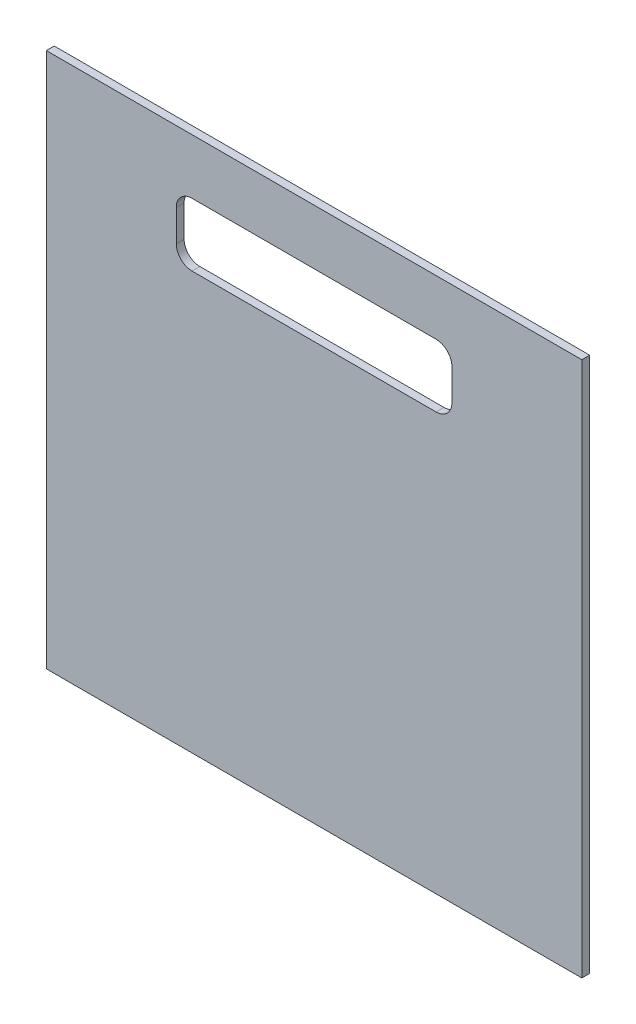
ISO-10303-21;
HEADER;
FILE_DESCRIPTION(('STEP AP214'),'2;1');
FILE_NAME('part.step','',(''),(''),'','','');
FILE_SCHEMA(('AUTOMOTIVE_DESIGN { 1 0 10303 214 1 1 1 1 }'));
ENDSEC;
DATA;
#1=APPLICATION_CONTEXT('core data for automotive mechanical design processes');
#2=APPLICATION_PROTOCOL_DEFINITION('international standard','automotive_design',2000,#1);
#3=PRODUCT_CONTEXT('',#1,'mechanical');
#4=PRODUCT('Part','Part','',(#3));
#5=PRODUCT_RELATED_PRODUCT_CATEGORY('part','',(#4));
#6=PRODUCT_DEFINITION_FORMATION('','',#4);
#7=PRODUCT_DEFINITION_CONTEXT('part definition',#1,'design');
#8=PRODUCT_DEFINITION('design','',#6,#7);
#9=PRODUCT_DEFINITION_SHAPE('','',#8);
#10=(LENGTH_UNIT() NAMED_UNIT(*) SI_UNIT(.MILLI.,.METRE.));
#11=(NAMED_UNIT(*) PLANE_ANGLE_UNIT() SI_UNIT($,.RADIAN.));
#12=(NAMED_UNIT(*) SI_UNIT($,.STERADIAN.) SOLID_ANGLE_UNIT());
#13=UNCERTAINTY_MEASURE_WITH_UNIT(LENGTH_MEASURE(1.E-05),#10,'distance_accuracy_value','');
#14=(GEOMETRIC_REPRESENTATION_CONTEXT(3) GLOBAL_UNCERTAINTY_ASSIGNED_CONTEXT((#13)) GLOBAL_UNIT_ASSIGNED_CONTEXT((#10,
#11,#12)) REPRESENTATION_CONTEXT('',''));
#15=CARTESIAN_POINT('',(0.,0.,0.));
#16=DIRECTION('',(0.,0.,1.));
#17=DIRECTION('',(1.,0.,0.));
#18=AXIS2_PLACEMENT_3D('',#15,#16,#17);
#19=CARTESIAN_POINT('',(0.,0.,1.));
#20=DIRECTION('',(0.,0.,-1.));
#21=DIRECTION('',(-1.,0.,0.));
#22=AXIS2_PLACEMENT_3D('',#19,#20,#21);
#23=PLANE('',#22);
#24=DIRECTION('',(0.,1.,0.));
#25=VECTOR('',#24,1.);
#26=CARTESIAN_POINT('',(34.,-34.,1.));
#27=LINE('',#26,#25);
#28=CARTESIAN_POINT('',(34.,-34.,1.));
#29=VERTEX_POINT('',#28);
#30=CARTESIAN_POINT('',(34.,34.,1.));
#31=VERTEX_POINT('',#30);
#32=EDGE_CURVE('E195',#29,#31,#27,.T.);
#33=ORIENTED_EDGE('',*,*,#32,.T.);
#34=DIRECTION('',(-1.,0.,0.));
#35=VECTOR('',#34,1.);
#36=CARTESIAN_POINT('',(-34.,34.,1.));
#37=LINE('',#36,#35);
#38=CARTESIAN_POINT('',(-34.,34.,1.));
#39=VERTEX_POINT('',#38);
#40=EDGE_CURVE('E198',#31,#39,#37,.T.);
#41=ORIENTED_EDGE('',*,*,#40,.T.);
#42=DIRECTION('',(0.,-1.,0.));
#43=VECTOR('',#42,1.);
#44=CARTESIAN_POINT('',(-34.,-34.,1.));
#45=LINE('',#44,#43);
#46=CARTESIAN_POINT('',(-34.,-34.,1.));
#47=VERTEX_POINT('',#46);
#48=EDGE_CURVE('E201',#39,#47,#45,.T.);
#49=ORIENTED_EDGE('',*,*,#48,.T.);
#50=DIRECTION('',(1.,0.,0.));
#51=VECTOR('',#50,1.);
#52=CARTESIAN_POINT('',(-34.,-34.,1.));
#53=LINE('',#52,#51);
#54=EDGE_CURVE('E203',#47,#29,#53,.T.);
#55=ORIENTED_EDGE('',*,*,#54,.T.);
#56=EDGE_LOOP('',(#33,#41,#49,#55));
#57=FACE_BOUND('',#56,.T.);
#58=CARTESIAN_POINT('',(15.5,21.,1.));
#59=DIRECTION('',(0.,0.,1.));
#60=DIRECTION('',(-1.,0.,0.));
#61=AXIS2_PLACEMENT_3D('',#58,#59,#60);
#62=CIRCLE('',#61,2.);
#63=CARTESIAN_POINT('',(15.5,19.,1.));
#64=VERTEX_POINT('',#63);
#65=CARTESIAN_POINT('',(17.5,21.,1.));
#66=VERTEX_POINT('',#65);
#67=EDGE_CURVE('E130',#64,#66,#62,.T.);
#68=ORIENTED_EDGE('',*,*,#67,.F.);
#69=DIRECTION('',(1.,0.,0.));
#70=VECTOR('',#69,1.);
#71=CARTESIAN_POINT('',(15.5,19.,1.));
#72=LINE('',#71,#70);
#73=CARTESIAN_POINT('',(-15.5,19.,1.));
#74=VERTEX_POINT('',#73);
#75=EDGE_CURVE('E163',#74,#64,#72,.T.);
#76=ORIENTED_EDGE('',*,*,#75,.F.);
#77=CARTESIAN_POINT('',(-15.5,21.,1.));
#78=DIRECTION('',(0.,0.,1.));
#79=DIRECTION('',(1.,0.,0.));
#80=AXIS2_PLACEMENT_3D('',#77,#78,#79);
#81=CIRCLE('',#80,2.);
#82=CARTESIAN_POINT('',(-17.5,21.,1.));
#83=VERTEX_POINT('',#82);
#84=EDGE_CURVE('E161',#83,#74,#81,.T.);
#85=ORIENTED_EDGE('',*,*,#84,.F.);
#86=DIRECTION('',(0.,-1.,0.));
#87=VECTOR('',#86,1.);
#88=CARTESIAN_POINT('',(-17.5,21.,1.));
#89=LINE('',#88,#87);
#90=CARTESIAN_POINT('',(-17.5,25.,1.));
#91=VERTEX_POINT('',#90);
#92=EDGE_CURVE('E159',#91,#83,#89,.T.);
#93=ORIENTED_EDGE('',*,*,#92,.F.);
#94=CARTESIAN_POINT('',(-15.5,25.,1.));
#95=DIRECTION('',(0.,0.,1.));
#96=DIRECTION('',(-1.,0.,0.));
#97=AXIS2_PLACEMENT_3D('',#94,#95,#96);
#98=CIRCLE('',#97,2.);
#99=CARTESIAN_POINT('',(-15.5,27.,1.));
#100=VERTEX_POINT('',#99);
#101=EDGE_CURVE('E157',#100,#91,#98,.T.);
#102=ORIENTED_EDGE('',*,*,#101,.F.);
#103=DIRECTION('',(-1.,0.,0.));
#104=VECTOR('',#103,1.);
#105=CARTESIAN_POINT('',(15.5,27.,1.));
#106=LINE('',#105,#104);
#107=CARTESIAN_POINT('',(15.5,27.,1.));
#108=VERTEX_POINT('',#107);
#109=EDGE_CURVE('E153',#108,#100,#106,.T.);
#110=ORIENTED_EDGE('',*,*,#109,.F.);
#111=CARTESIAN_POINT('',(15.5,25.,1.));
#112=DIRECTION('',(0.,0.,1.));
#113=DIRECTION('',(1.,0.,0.));
#114=AXIS2_PLACEMENT_3D('',#111,#112,#113);
#115=CIRCLE('',#114,2.);
#116=CARTESIAN_POINT('',(17.5,25.,1.));
#117=VERTEX_POINT('',#116);
#118=EDGE_CURVE('E151',#117,#108,#115,.T.);
#119=ORIENTED_EDGE('',*,*,#118,.F.);
#120=DIRECTION('',(0.,1.,0.));
#121=VECTOR('',#120,1.);
#122=CARTESIAN_POINT('',(17.5,21.,1.));
#123=LINE('',#122,#121);
#124=EDGE_CURVE('E138',#66,#117,#123,.T.);
#125=ORIENTED_EDGE('',*,*,#124,.F.);
#126=EDGE_LOOP('',(#68,#76,#85,#93,#102,#110,#119,#125));
#127=FACE_BOUND('',#126,.T.);
#128=ADVANCED_FACE('F41',(#57,#127),#23,.F.);
#129=CARTESIAN_POINT('',(0.,0.,0.));
#130=DIRECTION('',(0.,0.,-1.));
#131=DIRECTION('',(-1.,0.,0.));
#132=AXIS2_PLACEMENT_3D('',#129,#130,#131);
#133=PLANE('',#132);
#134=DIRECTION('',(0.,1.,0.));
#135=VECTOR('',#134,1.);
#136=CARTESIAN_POINT('',(34.,-34.,0.));
#137=LINE('',#136,#135);
#138=CARTESIAN_POINT('',(34.,-34.,0.));
#139=VERTEX_POINT('',#138);
#140=CARTESIAN_POINT('',(34.,34.,0.));
#141=VERTEX_POINT('',#140);
#142=EDGE_CURVE('E146',#139,#141,#137,.T.);
#143=ORIENTED_EDGE('',*,*,#142,.F.);
#144=DIRECTION('',(1.,0.,0.));
#145=VECTOR('',#144,1.);
#146=CARTESIAN_POINT('',(-34.,-34.,0.));
#147=LINE('',#146,#145);
#148=CARTESIAN_POINT('',(-34.,-34.,0.));
#149=VERTEX_POINT('',#148);
#150=EDGE_CURVE('E199',#149,#139,#147,.T.);
#151=ORIENTED_EDGE('',*,*,#150,.F.);
#152=DIRECTION('',(0.,-1.,0.));
#153=VECTOR('',#152,1.);
#154=CARTESIAN_POINT('',(-34.,-34.,0.));
#155=LINE('',#154,#153);
#156=CARTESIAN_POINT('',(-34.,34.,0.));
#157=VERTEX_POINT('',#156);
#158=EDGE_CURVE('E210',#157,#149,#155,.T.);
#159=ORIENTED_EDGE('',*,*,#158,.F.);
#160=DIRECTION('',(-1.,0.,0.));
#161=VECTOR('',#160,1.);
#162=CARTESIAN_POINT('',(-34.,34.,0.));
#163=LINE('',#162,#161);
#164=EDGE_CURVE('E208',#141,#157,#163,.T.);
#165=ORIENTED_EDGE('',*,*,#164,.F.);
#166=EDGE_LOOP('',(#143,#151,#159,#165));
#167=FACE_BOUND('',#166,.T.);
#168=DIRECTION('',(1.,0.,0.));
#169=VECTOR('',#168,1.);
#170=CARTESIAN_POINT('',(15.5,19.,0.));
#171=LINE('',#170,#169);
#172=CARTESIAN_POINT('',(-15.5,19.,0.));
#173=VERTEX_POINT('',#172);
#174=CARTESIAN_POINT('',(15.5,19.,0.));
#175=VERTEX_POINT('',#174);
#176=EDGE_CURVE('E139',#173,#175,#171,.T.);
#177=ORIENTED_EDGE('',*,*,#176,.T.);
#178=CARTESIAN_POINT('',(15.5,21.,0.));
#179=DIRECTION('',(0.,0.,1.));
#180=DIRECTION('',(-1.,0.,0.));
#181=AXIS2_PLACEMENT_3D('',#178,#179,#180);
#182=CIRCLE('',#181,2.);
#183=CARTESIAN_POINT('',(17.5,21.,0.));
#184=VERTEX_POINT('',#183);
#185=EDGE_CURVE('E64',#175,#184,#182,.T.);
#186=ORIENTED_EDGE('',*,*,#185,.T.);
#187=DIRECTION('',(0.,1.,0.));
#188=VECTOR('',#187,1.);
#189=CARTESIAN_POINT('',(17.5,21.,0.));
#190=LINE('',#189,#188);
#191=CARTESIAN_POINT('',(17.5,25.,0.));
#192=VERTEX_POINT('',#191);
#193=EDGE_CURVE('E145',#184,#192,#190,.T.);
#194=ORIENTED_EDGE('',*,*,#193,.T.);
#195=CARTESIAN_POINT('',(15.5,25.,0.));
#196=DIRECTION('',(0.,0.,1.));
#197=DIRECTION('',(1.,0.,0.));
#198=AXIS2_PLACEMENT_3D('',#195,#196,#197);
#199=CIRCLE('',#198,2.);
#200=CARTESIAN_POINT('',(15.5,27.,0.));
#201=VERTEX_POINT('',#200);
#202=EDGE_CURVE('E167',#192,#201,#199,.T.);
#203=ORIENTED_EDGE('',*,*,#202,.T.);
#204=DIRECTION('',(-1.,0.,0.));
#205=VECTOR('',#204,1.);
#206=CARTESIAN_POINT('',(15.5,27.,0.));
#207=LINE('',#206,#205);
#208=CARTESIAN_POINT('',(-15.5,27.,0.));
#209=VERTEX_POINT('',#208);
#210=EDGE_CURVE('E170',#201,#209,#207,.T.);
#211=ORIENTED_EDGE('',*,*,#210,.T.);
#212=CARTESIAN_POINT('',(-15.5,25.,0.));
#213=DIRECTION('',(0.,0.,1.));
#214=DIRECTION('',(-1.,0.,0.));
#215=AXIS2_PLACEMENT_3D('',#212,#213,#214);
#216=CIRCLE('',#215,2.);
#217=CARTESIAN_POINT('',(-17.5,25.,0.));
#218=VERTEX_POINT('',#217);
#219=EDGE_CURVE('E173',#209,#218,#216,.T.);
#220=ORIENTED_EDGE('',*,*,#219,.T.);
#221=DIRECTION('',(0.,-1.,0.));
#222=VECTOR('',#221,1.);
#223=CARTESIAN_POINT('',(-17.5,21.,0.));
#224=LINE('',#223,#222);
#225=CARTESIAN_POINT('',(-17.5,21.,0.));
#226=VERTEX_POINT('',#225);
#227=EDGE_CURVE('E176',#218,#226,#224,.T.);
#228=ORIENTED_EDGE('',*,*,#227,.T.);
#229=CARTESIAN_POINT('',(-15.5,21.,0.));
#230=DIRECTION('',(0.,0.,1.));
#231=DIRECTION('',(1.,0.,0.));
#232=AXIS2_PLACEMENT_3D('',#229,#230,#231);
#233=CIRCLE('',#232,2.);
#234=EDGE_CURVE('E179',#226,#173,#233,.T.);
#235=ORIENTED_EDGE('',*,*,#234,.T.);
#236=EDGE_LOOP('',(#177,#186,#194,#203,#211,#220,#228,#235));
#237=FACE_BOUND('',#236,.T.);
#238=ADVANCED_FACE('F228',(#167,#237),#133,.T.);
#239=CARTESIAN_POINT('',(34.,-34.,1.));
#240=DIRECTION('',(-1.,0.,0.));
#241=DIRECTION('',(0.,0.,1.));
#242=AXIS2_PLACEMENT_3D('',#239,#240,#241);
#243=PLANE('',#242);
#244=ORIENTED_EDGE('',*,*,#142,.T.);
#245=DIRECTION('',(0.,0.,-1.));
#246=VECTOR('',#245,1.);
#247=CARTESIAN_POINT('',(34.,34.,1.));
#248=LINE('',#247,#246);
#249=EDGE_CURVE('E11',#31,#141,#248,.T.);
#250=ORIENTED_EDGE('',*,*,#249,.F.);
#251=ORIENTED_EDGE('',*,*,#32,.F.);
#252=DIRECTION('',(0.,0.,-1.));
#253=VECTOR('',#252,1.);
#254=CARTESIAN_POINT('',(34.,-34.,1.));
#255=LINE('',#254,#253);
#256=EDGE_CURVE('E205',#29,#139,#255,.T.);
#257=ORIENTED_EDGE('',*,*,#256,.T.);
#258=EDGE_LOOP('',(#244,#250,#251,#257));
#259=FACE_BOUND('',#258,.T.);
#260=ADVANCED_FACE('F43',(#259),#243,.F.);
#261=CARTESIAN_POINT('',(-34.,34.,1.));
#262=DIRECTION('',(0.,-1.,0.));
#263=DIRECTION('',(0.,0.,-1.));
#264=AXIS2_PLACEMENT_3D('',#261,#262,#263);
#265=PLANE('',#264);
#266=ORIENTED_EDGE('',*,*,#164,.T.);
#267=DIRECTION('',(0.,0.,-1.));
#268=VECTOR('',#267,1.);
#269=CARTESIAN_POINT('',(-34.,34.,1.));
#270=LINE('',#269,#268);
#271=EDGE_CURVE('E49',#39,#157,#270,.T.);
#272=ORIENTED_EDGE('',*,*,#271,.F.);
#273=ORIENTED_EDGE('',*,*,#40,.F.);
#274=ORIENTED_EDGE('',*,*,#249,.T.);
#275=EDGE_LOOP('',(#266,#272,#273,#274));
#276=FACE_BOUND('',#275,.T.);
#277=ADVANCED_FACE('F238',(#276),#265,.F.);
#278=CARTESIAN_POINT('',(-34.,-34.,1.));
#279=DIRECTION('',(1.,0.,0.));
#280=DIRECTION('',(0.,0.,-1.));
#281=AXIS2_PLACEMENT_3D('',#278,#279,#280);
#282=PLANE('',#281);
#283=ORIENTED_EDGE('',*,*,#158,.T.);
#284=DIRECTION('',(0.,0.,-1.));
#285=VECTOR('',#284,1.);
#286=CARTESIAN_POINT('',(-34.,-34.,1.));
#287=LINE('',#286,#285);
#288=EDGE_CURVE('E215',#47,#149,#287,.T.);
#289=ORIENTED_EDGE('',*,*,#288,.F.);
#290=ORIENTED_EDGE('',*,*,#48,.F.);
#291=ORIENTED_EDGE('',*,*,#271,.T.);
#292=EDGE_LOOP('',(#283,#289,#290,#291));
#293=FACE_BOUND('',#292,.T.);
#294=ADVANCED_FACE('F222',(#293),#282,.F.);
#295=CARTESIAN_POINT('',(-34.,-34.,1.));
#296=DIRECTION('',(0.,1.,0.));
#297=DIRECTION('',(-1.,0.,0.));
#298=AXIS2_PLACEMENT_3D('',#295,#296,#297);
#299=PLANE('',#298);
#300=ORIENTED_EDGE('',*,*,#150,.T.);
#301=ORIENTED_EDGE('',*,*,#256,.F.);
#302=ORIENTED_EDGE('',*,*,#54,.F.);
#303=ORIENTED_EDGE('',*,*,#288,.T.);
#304=EDGE_LOOP('',(#300,#301,#302,#303));
#305=FACE_BOUND('',#304,.T.);
#306=ADVANCED_FACE('F232',(#305),#299,.F.);
#307=CARTESIAN_POINT('',(15.5,21.,1.));
#308=DIRECTION('',(0.,0.,-1.));
#309=DIRECTION('',(-1.,0.,0.));
#310=AXIS2_PLACEMENT_3D('',#307,#308,#309);
#311=CYLINDRICAL_SURFACE('',#310,2.);
#312=ORIENTED_EDGE('',*,*,#185,.F.);
#313=DIRECTION('',(0.,0.,-1.));
#314=VECTOR('',#313,1.);
#315=CARTESIAN_POINT('',(15.5,19.,1.));
#316=LINE('',#315,#314);
#317=EDGE_CURVE('E134',#64,#175,#316,.T.);
#318=ORIENTED_EDGE('',*,*,#317,.F.);
#319=ORIENTED_EDGE('',*,*,#67,.T.);
#320=DIRECTION('',(0.,0.,-1.));
#321=VECTOR('',#320,1.);
#322=CARTESIAN_POINT('',(17.5,21.,1.));
#323=LINE('',#322,#321);
#324=EDGE_CURVE('E133',#66,#184,#323,.T.);
#325=ORIENTED_EDGE('',*,*,#324,.T.);
#326=EDGE_LOOP('',(#312,#318,#319,#325));
#327=FACE_BOUND('',#326,.T.);
#328=ADVANCED_FACE('F132',(#327),#311,.F.);
#329=CARTESIAN_POINT('',(17.5,21.,1.));
#330=DIRECTION('',(-1.,0.,0.));
#331=DIRECTION('',(0.,0.,1.));
#332=AXIS2_PLACEMENT_3D('',#329,#330,#331);
#333=PLANE('',#332);
#334=ORIENTED_EDGE('',*,*,#193,.F.);
#335=ORIENTED_EDGE('',*,*,#324,.F.);
#336=ORIENTED_EDGE('',*,*,#124,.T.);
#337=DIRECTION('',(0.,0.,-1.));
#338=VECTOR('',#337,1.);
#339=CARTESIAN_POINT('',(17.5,25.,1.));
#340=LINE('',#339,#338);
#341=EDGE_CURVE('E147',#117,#192,#340,.T.);
#342=ORIENTED_EDGE('',*,*,#341,.T.);
#343=EDGE_LOOP('',(#334,#335,#336,#342));
#344=FACE_BOUND('',#343,.T.);
#345=ADVANCED_FACE('F142',(#344),#333,.T.);
#346=CARTESIAN_POINT('',(15.5,25.,1.));
#347=DIRECTION('',(0.,0.,-1.));
#348=DIRECTION('',(-1.,0.,0.));
#349=AXIS2_PLACEMENT_3D('',#346,#347,#348);
#350=CYLINDRICAL_SURFACE('',#349,2.);
#351=ORIENTED_EDGE('',*,*,#202,.F.);
#352=ORIENTED_EDGE('',*,*,#341,.F.);
#353=ORIENTED_EDGE('',*,*,#118,.T.);
#354=DIRECTION('',(0.,0.,-1.));
#355=VECTOR('',#354,1.);
#356=CARTESIAN_POINT('',(15.5,27.,1.));
#357=LINE('',#356,#355);
#358=EDGE_CURVE('E192',#108,#201,#357,.T.);
#359=ORIENTED_EDGE('',*,*,#358,.T.);
#360=EDGE_LOOP('',(#351,#352,#353,#359));
#361=FACE_BOUND('',#360,.T.);
#362=ADVANCED_FACE('F261',(#361),#350,.F.);
#363=CARTESIAN_POINT('',(15.5,27.,1.));
#364=DIRECTION('',(0.,-1.,0.));
#365=DIRECTION('',(1.,0.,0.));
#366=AXIS2_PLACEMENT_3D('',#363,#364,#365);
#367=PLANE('',#366);
#368=ORIENTED_EDGE('',*,*,#210,.F.);
#369=ORIENTED_EDGE('',*,*,#358,.F.);
#370=ORIENTED_EDGE('',*,*,#109,.T.);
#371=DIRECTION('',(0.,0.,-1.));
#372=VECTOR('',#371,1.);
#373=CARTESIAN_POINT('',(-15.5,27.,1.));
#374=LINE('',#373,#372);
#375=EDGE_CURVE('E190',#100,#209,#374,.T.);
#376=ORIENTED_EDGE('',*,*,#375,.T.);
#377=EDGE_LOOP('',(#368,#369,#370,#376));
#378=FACE_BOUND('',#377,.T.);
#379=ADVANCED_FACE('F265',(#378),#367,.T.);
#380=CARTESIAN_POINT('',(-15.5,25.,1.));
#381=DIRECTION('',(0.,0.,-1.));
#382=DIRECTION('',(-1.,0.,0.));
#383=AXIS2_PLACEMENT_3D('',#380,#381,#382);
#384=CYLINDRICAL_SURFACE('',#383,2.);
#385=ORIENTED_EDGE('',*,*,#219,.F.);
#386=ORIENTED_EDGE('',*,*,#375,.F.);
#387=ORIENTED_EDGE('',*,*,#101,.T.);
#388=DIRECTION('',(0.,0.,-1.));
#389=VECTOR('',#388,1.);
#390=CARTESIAN_POINT('',(-17.5,25.,1.));
#391=LINE('',#390,#389);
#392=EDGE_CURVE('E188',#91,#218,#391,.T.);
#393=ORIENTED_EDGE('',*,*,#392,.T.);
#394=EDGE_LOOP('',(#385,#386,#387,#393));
#395=FACE_BOUND('',#394,.T.);
#396=ADVANCED_FACE('F271',(#395),#384,.F.);
#397=CARTESIAN_POINT('',(-17.5,21.,1.));
#398=DIRECTION('',(1.,0.,0.));
#399=DIRECTION('',(0.,0.,-1.));
#400=AXIS2_PLACEMENT_3D('',#397,#398,#399);
#401=PLANE('',#400);
#402=ORIENTED_EDGE('',*,*,#227,.F.);
#403=ORIENTED_EDGE('',*,*,#392,.F.);
#404=ORIENTED_EDGE('',*,*,#92,.T.);
#405=DIRECTION('',(0.,0.,-1.));
#406=VECTOR('',#405,1.);
#407=CARTESIAN_POINT('',(-17.5,21.,1.));
#408=LINE('',#407,#406);
#409=EDGE_CURVE('E186',#83,#226,#408,.T.);
#410=ORIENTED_EDGE('',*,*,#409,.T.);
#411=EDGE_LOOP('',(#402,#403,#404,#410));
#412=FACE_BOUND('',#411,.T.);
#413=ADVANCED_FACE('F275',(#412),#401,.T.);
#414=CARTESIAN_POINT('',(-15.5,21.,1.));
#415=DIRECTION('',(0.,0.,-1.));
#416=DIRECTION('',(-1.,0.,0.));
#417=AXIS2_PLACEMENT_3D('',#414,#415,#416);
#418=CYLINDRICAL_SURFACE('',#417,2.);
#419=ORIENTED_EDGE('',*,*,#234,.F.);
#420=ORIENTED_EDGE('',*,*,#409,.F.);
#421=ORIENTED_EDGE('',*,*,#84,.T.);
#422=DIRECTION('',(0.,0.,-1.));
#423=VECTOR('',#422,1.);
#424=CARTESIAN_POINT('',(-15.5,19.,1.));
#425=LINE('',#424,#423);
#426=EDGE_CURVE('E56',#74,#173,#425,.T.);
#427=ORIENTED_EDGE('',*,*,#426,.T.);
#428=EDGE_LOOP('',(#419,#420,#421,#427));
#429=FACE_BOUND('',#428,.T.);
#430=ADVANCED_FACE('F279',(#429),#418,.F.);
#431=CARTESIAN_POINT('',(15.5,19.,1.));
#432=DIRECTION('',(0.,1.,0.));
#433=DIRECTION('',(0.,0.,1.));
#434=AXIS2_PLACEMENT_3D('',#431,#432,#433);
#435=PLANE('',#434);
#436=ORIENTED_EDGE('',*,*,#176,.F.);
#437=ORIENTED_EDGE('',*,*,#426,.F.);
#438=ORIENTED_EDGE('',*,*,#75,.T.);
#439=ORIENTED_EDGE('',*,*,#317,.T.);
#440=EDGE_LOOP('',(#436,#437,#438,#439));
#441=FACE_BOUND('',#440,.T.);
#442=ADVANCED_FACE('F283',(#441),#435,.T.);
#443=CLOSED_SHELL('',(#128,#238,#260,#277,#294,#306,#328,#345,#362,#379,#396,#413,#430,#442));
#444=MANIFOLD_SOLID_BREP('B2',#443);
#445=ADVANCED_BREP_SHAPE_REPRESENTATION('',(#18,#444),#14);
#446=SHAPE_DEFINITION_REPRESENTATION(#9,#445);
ENDSEC;
END-ISO-10303-21;
